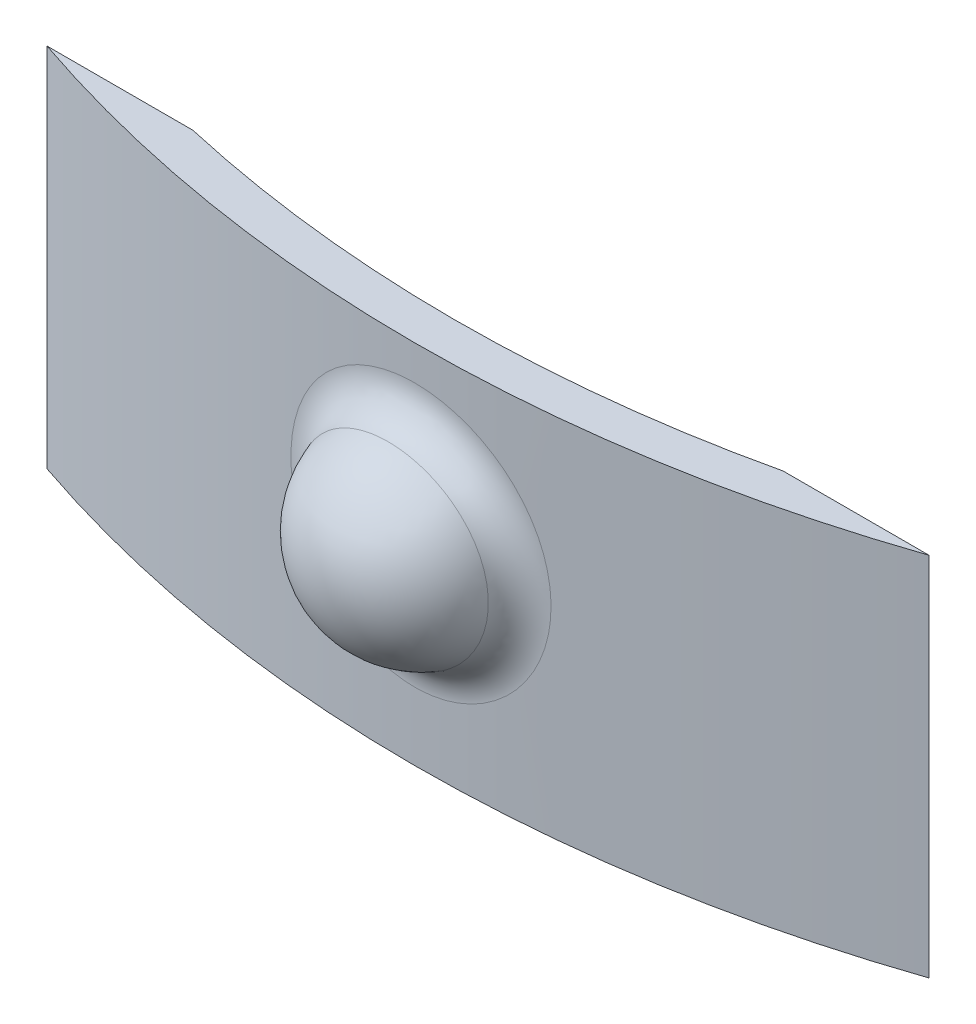
ISO-10303-21;
HEADER;
FILE_DESCRIPTION(('STEP AP214'),'2;1');
FILE_NAME('part.step','',(''),(''),'','','');
FILE_SCHEMA(('AUTOMOTIVE_DESIGN { 1 0 10303 214 1 1 1 1 }'));
ENDSEC;
DATA;
#1=APPLICATION_CONTEXT('core data for automotive mechanical design processes');
#2=APPLICATION_PROTOCOL_DEFINITION('international standard','automotive_design',2000,#1);
#3=PRODUCT_CONTEXT('',#1,'mechanical');
#4=PRODUCT('Part','Part','',(#3));
#5=PRODUCT_RELATED_PRODUCT_CATEGORY('part','',(#4));
#6=PRODUCT_DEFINITION_FORMATION('','',#4);
#7=PRODUCT_DEFINITION_CONTEXT('part definition',#1,'design');
#8=PRODUCT_DEFINITION('design','',#6,#7);
#9=PRODUCT_DEFINITION_SHAPE('','',#8);
#10=(LENGTH_UNIT() NAMED_UNIT(*) SI_UNIT(.MILLI.,.METRE.));
#11=(NAMED_UNIT(*) PLANE_ANGLE_UNIT() SI_UNIT($,.RADIAN.));
#12=(NAMED_UNIT(*) SI_UNIT($,.STERADIAN.) SOLID_ANGLE_UNIT());
#13=UNCERTAINTY_MEASURE_WITH_UNIT(LENGTH_MEASURE(1.E-05),#10,'distance_accuracy_value','');
#14=(GEOMETRIC_REPRESENTATION_CONTEXT(3) GLOBAL_UNCERTAINTY_ASSIGNED_CONTEXT((#13)) GLOBAL_UNIT_ASSIGNED_CONTEXT((#10,
#11,#12)) REPRESENTATION_CONTEXT('',''));
#15=CARTESIAN_POINT('',(0.,0.,0.));
#16=DIRECTION('',(0.,0.,1.));
#17=DIRECTION('',(1.,0.,0.));
#18=AXIS2_PLACEMENT_3D('',#15,#16,#17);
#19=CARTESIAN_POINT('',(0.,-7.62,0.));
#20=DIRECTION('',(0.,1.,0.));
#21=DIRECTION('',(0.,0.,1.));
#22=AXIS2_PLACEMENT_3D('',#19,#20,#21);
#23=PLANE('',#22);
#24=CARTESIAN_POINT('',(0.,-7.62,0.));
#25=DIRECTION('',(0.,1.,0.));
#26=DIRECTION('',(0.,0.,1.));
#27=AXIS2_PLACEMENT_3D('',#24,#25,#26);
#28=CIRCLE('',#27,50.546);
#29=CARTESIAN_POINT('',(-11.2593934117251,-7.62,49.276));
#30=VERTEX_POINT('',#29);
#31=CARTESIAN_POINT('',(11.2593934117251,-7.62,49.276));
#32=VERTEX_POINT('',#31);
#33=EDGE_CURVE('E11',#30,#32,#28,.T.);
#34=ORIENTED_EDGE('',*,*,#33,.T.);
#35=DIRECTION('',(-1.,0.,0.));
#36=VECTOR('',#35,1.);
#37=CARTESIAN_POINT('',(0.,-7.62,49.276));
#38=LINE('',#37,#36);
#39=CARTESIAN_POINT('',(16.8273801882527,-7.62,49.276));
#40=VERTEX_POINT('',#39);
#41=EDGE_CURVE('E45',#40,#32,#38,.T.);
#42=ORIENTED_EDGE('',*,*,#41,.F.);
#43=CARTESIAN_POINT('',(0.,-7.62,0.));
#44=DIRECTION('',(0.,1.,0.));
#45=DIRECTION('',(0.,0.,1.));
#46=AXIS2_PLACEMENT_3D('',#43,#44,#45);
#47=CIRCLE('',#46,52.07);
#48=CARTESIAN_POINT('',(-16.8273801882527,-7.62,49.276));
#49=VERTEX_POINT('',#48);
#50=EDGE_CURVE('E107',#49,#40,#47,.T.);
#51=ORIENTED_EDGE('',*,*,#50,.F.);
#52=DIRECTION('',(-1.,0.,0.));
#53=VECTOR('',#52,1.);
#54=CARTESIAN_POINT('',(0.,-7.62,49.276));
#55=LINE('',#54,#53);
#56=EDGE_CURVE('E51',#30,#49,#55,.T.);
#57=ORIENTED_EDGE('',*,*,#56,.F.);
#58=EDGE_LOOP('',(#34,#42,#51,#57));
#59=FACE_BOUND('',#58,.T.);
#60=ADVANCED_FACE('F38',(#59),#23,.F.);
#61=CARTESIAN_POINT('',(0.,0.,51.816));
#62=DIRECTION('',(0.,1.,0.));
#63=DIRECTION('',(-1.,0.,0.));
#64=AXIS2_PLACEMENT_3D('',#61,#62,#63);
#65=SPHERICAL_SURFACE('',#64,3.81);
#66=CARTESIAN_POINT('',(-0.0256478094244548,5.02887643908641,52.0699936834053));
#67=CARTESIAN_POINT('',(-0.0201786653162026,3.95126101170845,52.0699963773094));
#68=CARTESIAN_POINT('',(-0.0188560550124041,3.59205459934744,53.0859953560924));
#69=CARTESIAN_POINT('',(0.256753570660563,5.0303509438317,52.0701326257342));
#70=CARTESIAN_POINT('',(0.202007338086974,3.95239870261632,52.070076075759));
#71=CARTESIAN_POINT('',(0.188763078079634,3.59310781702199,53.0860975053306));
#72=CARTESIAN_POINT('',(0.539281677263079,5.00740975686317,52.0679527823639));
#73=CARTESIAN_POINT('',(0.42421250485955,3.93471903110067,52.0688277257015));
#74=CARTESIAN_POINT('',(0.396475379447347,3.57672125488846,53.084494902716));
#75=CARTESIAN_POINT('',(1.09658330014422,4.91327455036088,52.0591980755026));
#76=CARTESIAN_POINT('',(0.863041972229046,3.86203588788429,52.0637993241447));
#77=CARTESIAN_POINT('',(0.806198872231116,3.50948182167426,53.078058515436));
#78=CARTESIAN_POINT('',(1.37135667539314,4.84207965385995,52.0526231321348));
#79=CARTESIAN_POINT('',(1.07953497679463,3.80707685579507,52.0600223171547));
#80=CARTESIAN_POINT('',(1.00820995996331,3.45862832418846,53.0732246720457));
#81=CARTESIAN_POINT('',(1.90541320793571,4.65322409592396,52.0358122446449));
#82=CARTESIAN_POINT('',(1.5011044941938,3.66091841170117,52.0503255913651));
#83=CARTESIAN_POINT('',(1.40084385670006,3.32373149708575,53.0608654481651));
#84=CARTESIAN_POINT('',(2.16468994129502,4.53554431648749,52.0255747943944));
#85=CARTESIAN_POINT('',(1.7060828424537,3.56978356717734,52.0444099575079));
#86=CARTESIAN_POINT('',(1.59146194288181,3.23967451175352,53.0533389603817));
#87=CARTESIAN_POINT('',(2.66009617291731,4.2567973789634,52.002599461179));
#88=CARTESIAN_POINT('',(2.09863357590841,3.35328302005037,52.0310708511581));
#89=CARTESIAN_POINT('',(1.95568046163595,3.04056955640494,53.0364476875231));
#90=CARTESIAN_POINT('',(2.89622631492195,4.09573142797794,51.9898616477826));
#91=CARTESIAN_POINT('',(2.28616688154373,3.22800987360914,52.0236521073533));
#92=CARTESIAN_POINT('',(2.12928136748183,2.9255224486044,53.027082953594));
#93=CARTESIAN_POINT('',(3.336631606367,3.73592862260019,51.9634503894941));
#94=CARTESIAN_POINT('',(2.6367613010391,2.94732956321196,52.0081959384188));
#95=CARTESIAN_POINT('',(2.45306365479035,2.66852044466606,53.0076656173655));
#96=CARTESIAN_POINT('',(3.54113654325632,3.53748925678059,51.9497848442568));
#97=CARTESIAN_POINT('',(2.8000138324632,2.7922370918186,52.0001660490523));
#98=CARTESIAN_POINT('',(2.60341397406564,2.52677804036733,52.9976188228253));
#99=CARTESIAN_POINT('',(3.91427960121024,3.10758203719992,51.923004518975));
#100=CARTESIAN_POINT('',(3.09851078922523,2.45533124778453,51.9843632349153));
#101=CARTESIAN_POINT('',(2.87774563003093,2.2197014549947,52.977930151632));
#102=CARTESIAN_POINT('',(4.08292042443481,2.87611667395995,51.9098896974964));
#103=CARTESIAN_POINT('',(3.23382072757573,2.2735554033327,51.9765891842777));
#104=CARTESIAN_POINT('',(3.00172895332629,2.05436905286442,52.9682882445168));
#105=CARTESIAN_POINT('',(4.37700798470702,2.39018868719585,51.8859156763468));
#106=CARTESIAN_POINT('',(3.47015675020773,1.8911044606407,51.9623317348944));
#107=CARTESIAN_POINT('',(3.21793966803126,1.70727763367595,52.9506627446155));
#108=CARTESIAN_POINT('',(4.50303260117775,2.13609816466612,51.8750271634983));
#109=CARTESIAN_POINT('',(3.57172348018552,1.69071861811341,51.9558278911846));
#110=CARTESIAN_POINT('',(3.31059191157343,1.52578440304851,52.9426576010258));
#111=CARTESIAN_POINT('',(4.71122692229067,1.60942853715623,51.8565351568469));
#112=CARTESIAN_POINT('',(3.739655111825,1.27475403363526,51.9447609747939));
#113=CARTESIAN_POINT('',(3.46365463559433,1.14959181195146,52.9290624323854));
#114=CARTESIAN_POINT('',(4.79340079213001,1.33685119093443,51.8489313510566));
#115=CARTESIAN_POINT('',(3.80610521693668,1.05910258082512,51.9401927992679));
#116=CARTESIAN_POINT('',(3.52406817829105,0.954893707737781,52.9234721779641));
#117=CARTESIAN_POINT('',(4.91039787667223,0.785388211445684,51.8379814742518));
#118=CARTESIAN_POINT('',(3.90071864932758,0.622505727672967,51.9336110554342));
#119=CARTESIAN_POINT('',(3.6100834562655,0.560991579675488,52.9154219200851));
#120=CARTESIAN_POINT('',(4.94592005815649,0.506660862425416,51.8345726020452));
#121=CARTESIAN_POINT('',(3.92949972537912,0.40157886790685,51.9315562291145));
#122=CARTESIAN_POINT('',(3.63619906610189,0.361900616007833,52.9129157457167));
#123=CARTESIAN_POINT('',(4.97080080767692,-0.0529815464936421,51.832192792017));
#124=CARTESIAN_POINT('',(3.94964300973952,-0.0419653088443997,51.9301230261814));
#125=CARTESIAN_POINT('',(3.65449118508809,-0.0378439618660956,52.9111661292878));
#126=CARTESIAN_POINT('',(4.96016201522152,-0.333896480388332,51.8332216004466));
#127=CARTESIAN_POINT('',(3.94101943921445,-0.264715511068408,51.9307436346518));
#128=CARTESIAN_POINT('',(3.64666963478231,-0.238497486069446,52.9119225006731));
#129=CARTESIAN_POINT('',(4.89332925697731,-0.887582332559981,51.8395728556964));
#130=CARTESIAN_POINT('',(3.88693066084454,-0.703396868010395,51.9345663495603));
#131=CARTESIAN_POINT('',(3.59753475000418,-0.633987380322827,52.9165918904285));
#132=CARTESIAN_POINT('',(4.83749904355246,-1.16040031482007,51.8448610166937));
#133=CARTESIAN_POINT('',(3.84172829053023,-0.919493259393901,51.9377500474398));
#134=CARTESIAN_POINT('',(3.55648884324133,-0.828857367504784,52.9204797021487));
#135=CARTESIAN_POINT('',(4.68245778362999,-1.69253243148247,51.8590927266793));
#136=CARTESIAN_POINT('',(3.71647221179892,-1.34039770629266,51.9462902470894));
#137=CARTESIAN_POINT('',(3.44250380534484,-1.20895173658967,52.9309427363056));
#138=CARTESIAN_POINT('',(4.58324633818509,-1.95184644167353,51.8680363092838));
#139=CARTESIAN_POINT('',(3.63635327023798,-1.5452995890776,51.9516509979412));
#140=CARTESIAN_POINT('',(3.36956438090851,-1.39417602977026,52.9375179834568));
#141=CARTESIAN_POINT('',(4.34394501701668,-2.45081597160628,51.8886254245676));
#142=CARTESIAN_POINT('',(3.44360870372013,-1.93885182267869,51.9639427754613));
#143=CARTESIAN_POINT('',(3.19363205096507,-1.75058283685816,52.952654928887));
#144=CARTESIAN_POINT('',(4.20369269676194,-2.6903884273575,51.9002816559537));
#145=CARTESIAN_POINT('',(3.33077339744937,-2.12748103022153,51.9708844402547));
#146=CARTESIAN_POINT('',(3.09051971759311,-1.92170601934215,52.9612244927661));
#147=CARTESIAN_POINT('',(3.88661165975018,-3.14223841754475,51.9249877894701));
#148=CARTESIAN_POINT('',(3.07640544777461,-2.48252468454807,51.9855336525562));
#149=CARTESIAN_POINT('',(2.85740439062108,-2.24445601230504,52.9793882355199));
#150=CARTESIAN_POINT('',(3.70978200519552,-3.35451525192845,51.9380377273291));
#151=CARTESIAN_POINT('',(2.93479858861673,-2.64893562208133,51.9932439489599));
#152=CARTESIAN_POINT('',(2.72740070756004,-2.39608232274657,52.9889824406622));
#153=CARTESIAN_POINT('',(3.32205745251828,-3.74883018183852,51.9642858179296));
#154=CARTESIAN_POINT('',(2.62518054227991,-2.95743931225804,52.0086862955778));
#155=CARTESIAN_POINT('',(2.4423488589137,-2.67773584423063,53.0082798173501));
#156=CARTESIAN_POINT('',(3.11074225459797,-3.93043037066609,51.9774836435734));
#157=CARTESIAN_POINT('',(2.45680258016125,-3.09912823842034,52.0164169587708));
#158=CARTESIAN_POINT('',(2.28699169242753,-2.80745026477116,53.0179827484171));
#159=CARTESIAN_POINT('',(2.66174190040788,-4.25524582453447,52.0024087714263));
#160=CARTESIAN_POINT('',(2.09995363935504,-3.35212279846695,52.0309625257213));
#161=CARTESIAN_POINT('',(1.95689038668516,-3.03946130322384,53.0363074939818));
#162=CARTESIAN_POINT('',(2.4240488253367,-4.39844951839563,52.014135629779));
#163=CARTESIAN_POINT('',(1.91147774118884,-3.46334134882035,52.0377741093753));
#164=CARTESIAN_POINT('',(1.78214042559241,-3.14174965600771,53.04492898216));
#165=CARTESIAN_POINT('',(1.92509157567771,-4.6447241189598,52.0350094495615));
#166=CARTESIAN_POINT('',(1.51662527589876,-3.6543875578591,52.0498660971845));
#167=CARTESIAN_POINT('',(1.4153112281151,-3.31766008496029,53.0602752399337));
#168=CARTESIAN_POINT('',(1.6635160314687,-4.74712994092712,52.0441130357612));
#169=CARTESIAN_POINT('',(1.31007365758168,-3.73360645511172,52.0551158599744));
#170=CARTESIAN_POINT('',(1.22300307538822,-3.39080710060235,53.0669681204237));
#171=CARTESIAN_POINT('',(1.12759475049701,-4.90587271787714,52.0584772346008));
#172=CARTESIAN_POINT('',(0.887414565827098,-3.85635672417073,52.0633885834447));
#173=CARTESIAN_POINT('',(0.828998231185929,-3.50419479843612,53.0775285592958));
#174=CARTESIAN_POINT('',(0.853262145858384,-4.96225598550702,52.0637417099803));
#175=CARTESIAN_POINT('',(0.671419623991697,-3.89985563561235,52.06640935544));
#176=CARTESIAN_POINT('',(0.627311194338272,-3.54446856108998,53.0813989575318));
#177=CARTESIAN_POINT('',(0.390978795465778,-5.01692004444642,52.0688642579746));
#178=CARTESIAN_POINT('',(0.307586214647035,-3.94203958014771,52.0693489036818));
#179=CARTESIAN_POINT('',(0.287444340919765,-3.58351431745266,53.0851650119469));
#180=CARTESIAN_POINT('',(0.204399613776943,-5.02823512326483,52.0699331983759));
#181=CARTESIAN_POINT('',(0.160812369755194,-3.95076625428614,52.0699616894079));
#182=CARTESIAN_POINT('',(0.150272886784765,-3.59159651656609,53.0859508879863));
#183=CARTESIAN_POINT('',(-0.16883226631304,-5.02958731964654,52.0700607278954));
#184=CARTESIAN_POINT('',(-0.132830724627417,-3.95180944277735,52.0700348275174));
#185=CARTESIAN_POINT('',(-0.124124070356976,-3.59256237112412,53.0860446466226));
#186=CARTESIAN_POINT('',(-0.355484965204387,-5.0196242928449,52.0691193033739));
#187=CARTESIAN_POINT('',(-0.27965867488771,-3.94412555266946,52.0694951515138));
#188=CARTESIAN_POINT('',(-0.261349573724108,-3.58544592345091,53.0853525191917));
#189=CARTESIAN_POINT('',(-0.820359625975144,-4.96806431137672,52.0642834069517));
#190=CARTESIAN_POINT('',(-0.645514600071284,-3.90433905181015,52.0667203530884));
#191=CARTESIAN_POINT('',(-0.603121536863108,-3.54861736528373,53.0817972086154));
#192=CARTESIAN_POINT('',(-1.0972656298414,-4.91304254778585,52.059138615037));
#193=CARTESIAN_POINT('',(-0.863516543281382,-3.86189446102376,52.0637687341229));
#194=CARTESIAN_POINT('',(-0.80670051530389,-3.50931610551701,53.0780148006621));
#195=CARTESIAN_POINT('',(-1.63840029191505,-4.75620936156148,52.0449234210887));
#196=CARTESIAN_POINT('',(-1.29024700199229,-3.74063145323444,52.0555831380968));
#197=CARTESIAN_POINT('',(-1.2045381936974,-3.39729240105928,53.0675639089395));
#198=CARTESIAN_POINT('',(-1.90261501073197,-4.65434773441719,52.035848807552));
#199=CARTESIAN_POINT('',(-1.49885847473763,-3.66184310669717,52.0503512050201));
#200=CARTESIAN_POINT('',(-1.39878664552685,-3.32453409600354,53.0608923289083));
#201=CARTESIAN_POINT('',(-2.41059732631565,-4.40644767655325,52.0147917446968));
#202=CARTESIAN_POINT('',(-1.90080698447127,-3.4695568377352,52.0381553467124));
#203=CARTESIAN_POINT('',(-1.77225099599596,-3.1474626261182,53.0454113523617));
#204=CARTESIAN_POINT('',(-2.65436611706408,-4.26041182777477,52.0028094653367));
#205=CARTESIAN_POINT('',(-2.09408671914006,-3.35615019237268,52.0311964971753));
#206=CARTESIAN_POINT('',(-1.95146777244098,-3.0431513055323,53.0366020807984));
#207=CARTESIAN_POINT('',(-3.11426652850968,-3.92804916088858,51.9772966961473));
#208=CARTESIAN_POINT('',(-2.4595935831767,-3.09728017696763,52.0163083180778));
#209=CARTESIAN_POINT('',(-2.28958270914469,-2.80574940064942,53.0178453062355));
#210=CARTESIAN_POINT('',(-3.33040498886041,-3.74173234484446,51.9637665910466));
#211=CARTESIAN_POINT('',(-2.63182457917428,-2.9519084276015,52.0083825035811));
#212=CARTESIAN_POINT('',(-2.44848589785947,-2.67266596068357,53.0078980860852));
#213=CARTESIAN_POINT('',(-3.72720139332955,-3.3353298275758,51.936809888896));
#214=CARTESIAN_POINT('',(-2.94871725891149,-2.63391884534089,51.9925206027703));
#215=CARTESIAN_POINT('',(-2.74020729601628,-2.38237844818863,52.9880797441164));
#216=CARTESIAN_POINT('',(-3.90810360711124,-3.11549693739006,51.9233832480298));
#217=CARTESIAN_POINT('',(-3.09361561380864,-2.4615576856405,51.9845851813021));
#218=CARTESIAN_POINT('',(-2.87320509047525,-2.22535495497507,52.978208590084));
#219=CARTESIAN_POINT('',(-4.2308358889577,-2.64719514460847,51.8980849744444));
#220=CARTESIAN_POINT('',(-3.352574816907,-2.09350911110627,51.9695791653405));
#221=CARTESIAN_POINT('',(-3.11047516542009,-1.89085367445082,52.9596095109053));
#222=CARTESIAN_POINT('',(-4.37266777568966,-2.39872757567937,51.8862132693586));
#223=CARTESIAN_POINT('',(-3.46671847529593,-1.89782318761295,51.9625054088098));
#224=CARTESIAN_POINT('',(-3.21474878297483,-1.71337683975921,52.9508815325556));
#225=CARTESIAN_POINT('',(-4.61096752932058,-1.88427757003226,51.8655765843671));
#226=CARTESIAN_POINT('',(-3.65871313295236,-1.49194792181168,51.9501791207486));
#227=CARTESIAN_POINT('',(-3.38994476879458,-1.34591255003464,52.9357096142607));
#228=CARTESIAN_POINT('',(-4.70809681104576,-1.6186216093854,51.8567668140505));
#229=CARTESIAN_POINT('',(-3.73717612195199,-1.28197541535776,51.9448957239101));
#230=CARTESIAN_POINT('',(-3.46135340372801,-1.15615829220283,52.9292327447794));
#231=CARTESIAN_POINT('',(-4.85712148361142,-1.0740942433452,51.8430219946288));
#232=CARTESIAN_POINT('',(-3.85759984516515,-0.851170395258845,51.9366443990287));
#233=CARTESIAN_POINT('',(-3.57091509689659,-0.767210173550993,52.9191276684951));
#234=CARTESIAN_POINT('',(-4.90902099161398,-0.795224043250734,51.838086592853));
#235=CARTESIAN_POINT('',(-3.89962961861218,-0.630235597288075,51.933671930383));
#236=CARTESIAN_POINT('',(-3.60907118203476,-0.568017173658692,52.9154992024115));
#237=CARTESIAN_POINT('',(-4.96555767376359,-0.23627734161319,51.8327014628658));
#238=CARTESIAN_POINT('',(-3.94539150361747,-0.187335751327455,51.9304300264458));
#239=CARTESIAN_POINT('',(-3.65063647787761,-0.168769529814284,52.9115400998765));
#240=CARTESIAN_POINT('',(-4.97083166860076,0.0437304722633059,51.8321912957282));
#241=CARTESIAN_POINT('',(-3.94966650082615,0.0347011287872723,51.9301222721616));
#242=CARTESIAN_POINT('',(-3.65451387385292,0.0312360515165734,52.9111650292327));
#243=CARTESIAN_POINT('',(-4.9356229866862,0.600644366329077,51.8355556469129));
#244=CARTESIAN_POINT('',(-3.92116320672467,0.476059823698198,51.9321482197363));
#245=CARTESIAN_POINT('',(-3.62862874529339,0.429031690206182,52.913638472085));
#246=CARTESIAN_POINT('',(-4.89514212840436,0.877550569346317,51.8394299909782));
#247=CARTESIAN_POINT('',(-3.88836947714916,0.695512220223637,51.9344830203777));
#248=CARTESIAN_POINT('',(-3.59886755768234,0.626821835299192,52.9164868574688));
#249=CARTESIAN_POINT('',(-4.7699497990054,1.41921026489903,51.8510980167545));
#250=CARTESIAN_POINT('',(-3.78715106795522,1.1242596899383,51.9414938528266));
#251=CARTESIAN_POINT('',(-3.50682720428037,1.01372161773342,52.9250650924672));
#252=CARTESIAN_POINT('',(-4.68542650777843,1.68401028797568,51.8588750184174));
#253=CARTESIAN_POINT('',(-3.71882276170274,1.33370134892242,51.9461636458582));
#254=CARTESIAN_POINT('',(-3.44468638677738,1.2028644911766,52.93078267905));
#255=CARTESIAN_POINT('',(-4.47482239135441,2.19534937477479,51.8774707823781));
#256=CARTESIAN_POINT('',(-3.54899383735206,1.73745327053144,51.9572874898198));
#257=CARTESIAN_POINT('',(-3.28985200140055,1.56810669604452,52.9444541291988));
#258=CARTESIAN_POINT('',(-4.34874037781051,2.44188791607417,51.8882896316546));
#259=CARTESIAN_POINT('',(-3.44741484438726,1.93182807594967,51.9637461709135));
#260=CARTESIAN_POINT('',(-3.19715755986407,1.74420565430993,52.9524080567107));
#261=CARTESIAN_POINT('',(-4.05762982340946,2.91182492210153,51.9118671121506));
#262=CARTESIAN_POINT('',(-3.21353297557877,2.30160108225641,51.9777615614867));
#263=CARTESIAN_POINT('',(-2.98313551490143,2.07987494438722,52.9697420232298));
#264=CARTESIAN_POINT('',(-3.89230938989896,3.1350309695728,51.9246400133138));
#265=CARTESIAN_POINT('',(-3.08092197577439,2.47685450157217,51.9853297837485));
#266=CARTESIAN_POINT('',(-2.86159331443209,2.23930783529887,52.9791325533807));
#267=CARTESIAN_POINT('',(-3.52807798709669,3.55018069289813,51.9506575851244));
#268=CARTESIAN_POINT('',(-2.78959737582871,2.80214911882654,52.0006785846405));
#269=CARTESIAN_POINT('',(-2.59381343284036,2.53584335192749,52.9982604546024));
#270=CARTESIAN_POINT('',(-3.32916462597477,3.74212214078691,51.9639022893114));
#271=CARTESIAN_POINT('',(-2.63082504967537,2.95215468391276,52.0084600922109));
#272=CARTESIAN_POINT('',(-2.44757399326447,2.67294438624069,53.0079978503312));
#273=CARTESIAN_POINT('',(-2.90021127829641,4.09238082861202,51.9896184936823));
#274=CARTESIAN_POINT('',(-2.28934773090087,3.22538911414493,52.0235093786533));
#275=CARTESIAN_POINT('',(-2.13221107921436,2.92312916333051,53.0269041887339));
#276=CARTESIAN_POINT('',(-2.66975274591997,4.25015614047122,52.0020755826898));
#277=CARTESIAN_POINT('',(-2.10631010765737,3.3481126001499,52.0307654677121));
#278=CARTESIAN_POINT('',(-1.96277989335075,3.03582581462133,53.0360625364324));
#279=CARTESIAN_POINT('',(-2.18657893956274,4.52435994606165,52.0246308082746));
#280=CARTESIAN_POINT('',(-1.72341685029446,3.56110266109444,52.0438626946357));
#281=CARTESIAN_POINT('',(-1.60755455136819,3.2316856757379,53.0526449496724));
#282=CARTESIAN_POINT('',(-1.93386193230875,4.64078521629565,52.0347287609213));
#283=CARTESIAN_POINT('',(-1.52359567609938,3.65128124131598,52.0496993777082));
#284=CARTESIAN_POINT('',(-1.42175912096128,3.31484658306562,53.0600688799896));
#285=CARTESIAN_POINT('',(-1.40945551609441,4.83071667149954,52.0515904182868));
#286=CARTESIAN_POINT('',(-1.10958159791363,3.79829328502848,52.059427826933));
#287=CARTESIAN_POINT('',(-1.03621990904947,3.4505119082167,53.0724654294628));
#288=CARTESIAN_POINT('',(-1.13754659615473,4.90358576346897,52.058304414187));
#289=CARTESIAN_POINT('',(-0.895316020643894,3.85455273015014,52.0632856901066));
#290=CARTESIAN_POINT('',(-0.83631474490794,3.50256125961074,53.0774015031115));
#291=CARTESIAN_POINT('',(-0.585682897853317,5.0019357540489,52.0674372643695));
#292=CARTESIAN_POINT('',(-0.46072904495697,3.93049651533248,52.0685320880437));
#293=CARTESIAN_POINT('',(-0.430589168801683,3.57281125288106,53.0841158981981));
#294=CARTESIAN_POINT('',(-0.305727679411019,5.02741405566168,52.0698558832664));
#295=CARTESIAN_POINT('',(-0.24053389918454,3.9501326951528,52.0699173355595));
#296=CARTESIAN_POINT('',(-0.224768433293399,3.59101003975899,53.0858940465828));
#297=CARTESIAN_POINT('',(-0.0256478094244548,5.02887643908641,52.0699936834053));
#298=CARTESIAN_POINT('',(-0.0201786653162026,3.95126101170845,52.0699963773094));
#299=CARTESIAN_POINT('',(-0.0188560550124041,3.59205459934744,53.0859953560924));
#300=(BOUNDED_SURFACE() B_SPLINE_SURFACE(3,2,((#66,#67,#68),(#69,#70,#71),(#72,#73,#74),(#75,
#76,#77),(#78,#79,#80),(#81,#82,#83),(#84,#85,#86),(#87,#88,#89),(#90,#91,#92),(#93,#94,#95),
(#96,#97,#98),(#99,#100,#101),(#102,#103,#104),(#105,#106,#107),(#108,#109,#110),(#111,#112,
#113),(#114,#115,#116),(#117,#118,#119),(#120,#121,#122),(#123,#124,#125),(#126,#127,#128),
(#129,#130,#131),(#132,#133,#134),(#135,#136,#137),(#138,#139,#140),(#141,#142,#143),(#144,#145,
#146),(#147,#148,#149),(#150,#151,#152),(#153,#154,#155),(#156,#157,#158),(#159,#160,#161),
(#162,#163,#164),(#165,#166,#167),(#168,#169,#170),(#171,#172,#173),(#174,#175,#176),(#177,#178,
#179),(#180,#181,#182),(#183,#184,#185),(#186,#187,#188),(#189,#190,#191),(#192,#193,#194),
(#195,#196,#197),(#198,#199,#200),(#201,#202,#203),(#204,#205,#206),(#207,#208,#209),(#210,#211,
#212),(#213,#214,#215),(#216,#217,#218),(#219,#220,#221),(#222,#223,#224),(#225,#226,#227),
(#228,#229,#230),(#231,#232,#233),(#234,#235,#236),(#237,#238,#239),(#240,#241,#242),(#243,#244,
#245),(#246,#247,#248),(#249,#250,#251),(#252,#253,#254),(#255,#256,#257),(#258,#259,#260),
(#261,#262,#263),(#264,#265,#266),(#267,#268,#269),(#270,#271,#272),(#273,#274,#275),(#276,#277,
#278),(#279,#280,#281),(#282,#283,#284),(#285,#286,#287),(#288,#289,#290),(#291,#292,#293),
(#294,#295,#296),(#297,#298,#299)),.UNSPECIFIED.,.T.,.F.,.F.) B_SPLINE_SURFACE_WITH_KNOTS((4,2,
2,2,2,2,2,2,2,2,2,2,2,2,2,2,2,2,2,2,2,2,2,2,2,2,2,2,2,2,2,2,2,2,2,2,2,2,4),(3,3),(0.,
0.870993446450054,1.74200272283616,2.61337059586792,3.48471422796357,4.34939468263235,
5.2140099653755,6.06638084203138,6.91867074116113,7.75803961177165,8.59736048746744,
9.42999194188378,10.2626310535985,11.0986114860009,11.9346133545656,12.7816916781174,
13.6290249912666,14.4896557737654,15.3494194292536,15.9254360456918,16.5014565702255,
17.3681137317007,18.2357019779086,19.1032395242048,19.9705619013853,20.831639167193,
21.6926763443243,22.5405281765963,23.3883028228057,24.2244801973638,25.0606243402577,
25.8932248387939,26.7258491471101,27.5648729583533,28.4039565336397,29.2555064994339,
30.1071228343698,30.9709088542846,31.8347422079582),(0.,1.),
.UNSPECIFIED.) GEOMETRIC_REPRESENTATION_ITEM() RATIONAL_B_SPLINE_SURFACE(((1.,0.816496941748759,
1.),(1.,0.816489005208578,1.),(1.,0.816613555825614,1.),(1.,0.817113419194057,1.),(1.,
0.817488736502917,1.),(1.,0.818447285549964,1.),(1.,0.819030602823412,1.),(1.,0.820337905571916,
1.),(1.,0.821061887133214,1.),(1.,0.822560805260064,1.),(1.,0.823335309835809,1.),(1.,
0.824850975049924,1.),(1.,0.825592138197064,1.),(1.,0.826945401513559,1.),(1.,0.82755918078902,
1.),(1.,0.828600725634337,1.),(1.,0.829028508870456,1.),(1.,0.829644315019028,1.),(1.,
0.829835874465911,1.),(1.,0.829969620984357,1.),(1.,0.829911822314348,1.),(1.,0.829554805457686,
1.),(1.,0.829257515065792,1.),(1.,0.828456678705733,1.),(1.,0.827953130840763,1.),(1.,
0.826792480339247,1.),(1.,0.826134769607409,1.),(1.,0.824738769692104,1.),(1.,0.824000478442882,
1.),(1.,0.822513436571796,1.),(1.,0.821764676973297,1.),(1.,0.820348798169505,1.),(1.,
0.819681703607653,1.),(1.,0.818493118183908,1.),(1.,0.817974076619032,1.),(1.,0.817154634635509,
1.),(1.,0.816854014452272,1.),(1.,0.816561461876901,1.),(1.,0.816500396841062,1.),(1.,
0.816493111959352,1.),(1.,0.816546892892671,1.),(1.,0.816823082483938,1.),(1.,0.817116882298563,
1.),(1.,0.817927865326496,1.),(1.,0.818445288190489,1.),(1.,0.819644376032219,1.),(1.,
0.820326031410247,1.),(1.,0.821775301719308,1.),(1.,0.822542895288477,1.),(1.,0.824069994360532,
1.),(1.,0.824829518304112,1.),(1.,0.826258791475635,1.),(1.,0.826928544881523,1.),(1.,
0.828091680243927,1.),(1.,0.828587605978479,1.),(1.,0.82936093572978,1.),(1.,0.829638359636024,
1.),(1.,0.829941046949377,1.),(1.,0.829969707911973,1.),(1.,0.829780623620008,1.),(1.,
0.829562888158168,1.),(1.,0.828906611417198,1.),(1.,0.828469009841228,1.),(1.,0.827421451438997,
1.),(1.,0.826811489684272,1.),(1.,0.825480409371666,1.),(1.,0.824758472501647,1.),(1.,
0.823285849775608,1.),(1.,0.822535161875449,1.),(1.,0.821075683495941,1.),(1.,0.820367681195879,
1.),(1.,0.819084347421963,1.),(1.,0.818509026292671,1.),(1.,0.817547656896915,1.),(1.,
0.817164430843744,1.),(1.,0.816643002204202,1.),(1.,0.816504813045781,1.),(1.,0.816496941748759,1.))) REPRESENTATION_ITEM('') SURFACE());
#301=CARTESIAN_POINT('',(-0.0188560550124041,3.59205459934744,53.0859953560924));
#302=CARTESIAN_POINT('',(-0.224768433293399,3.59101003975899,53.0858940465828));
#303=CARTESIAN_POINT('',(-0.430589168801683,3.57281125288106,53.0841158981981));
#304=CARTESIAN_POINT('',(-0.83631474490794,3.50256125961074,53.0774015031115));
#305=CARTESIAN_POINT('',(-1.03621990904947,3.4505119082167,53.0724654294628));
#306=CARTESIAN_POINT('',(-1.42175912096128,3.31484658306562,53.0600688799896));
#307=CARTESIAN_POINT('',(-1.60755455136819,3.2316856757379,53.0526449496724));
#308=CARTESIAN_POINT('',(-1.96277989335075,3.03582581462133,53.0360625364324));
#309=CARTESIAN_POINT('',(-2.13221107921436,2.92312916333051,53.0269041887339));
#310=CARTESIAN_POINT('',(-2.44757399326447,2.67294438624069,53.0079978503312));
#311=CARTESIAN_POINT('',(-2.59381343284036,2.53584335192749,52.9982604546024));
#312=CARTESIAN_POINT('',(-2.86159331443209,2.23930783529887,52.9791325533807));
#313=CARTESIAN_POINT('',(-2.98313551490143,2.07987494438722,52.9697420232298));
#314=CARTESIAN_POINT('',(-3.19715755986407,1.74420565430993,52.9524080567107));
#315=CARTESIAN_POINT('',(-3.28985200140055,1.56810669604453,52.9444541291988));
#316=CARTESIAN_POINT('',(-3.44468638677737,1.2028644911766,52.93078267905));
#317=CARTESIAN_POINT('',(-3.50682720428037,1.01372161773341,52.9250650924672));
#318=CARTESIAN_POINT('',(-3.59886755768234,0.626821835299191,52.9164868574688));
#319=CARTESIAN_POINT('',(-3.62862874529339,0.429031690206183,52.913638472085));
#320=CARTESIAN_POINT('',(-3.65451387385292,0.0312360515165738,52.9111650292327));
#321=CARTESIAN_POINT('',(-3.65063647787761,-0.168769529814283,52.9115400998765));
#322=CARTESIAN_POINT('',(-3.60907118203476,-0.568017173658692,52.9154992024115));
#323=CARTESIAN_POINT('',(-3.57091509689659,-0.767210173550993,52.9191276684951));
#324=CARTESIAN_POINT('',(-3.46135340372801,-1.15615829220283,52.9292327447794));
#325=CARTESIAN_POINT('',(-3.38994476879459,-1.34591255003464,52.9357096142607));
#326=CARTESIAN_POINT('',(-3.21474878297483,-1.71337683975921,52.9508815325556));
#327=CARTESIAN_POINT('',(-3.11047516542009,-1.89085367445082,52.9596095109053));
#328=CARTESIAN_POINT('',(-2.87320509047525,-2.22535495497507,52.978208590084));
#329=CARTESIAN_POINT('',(-2.74020729601628,-2.38237844818863,52.9880797441164));
#330=CARTESIAN_POINT('',(-2.44848589785947,-2.67266596068357,53.0078980860852));
#331=CARTESIAN_POINT('',(-2.28958270914469,-2.80574940064942,53.0178453062355));
#332=CARTESIAN_POINT('',(-1.95146777244098,-3.0431513055323,53.0366020807984));
#333=CARTESIAN_POINT('',(-1.77225099599596,-3.1474626261182,53.0454113523617));
#334=CARTESIAN_POINT('',(-1.39878664552685,-3.32453409600354,53.0608923289083));
#335=CARTESIAN_POINT('',(-1.2045381936974,-3.39729240105928,53.0675639089395));
#336=CARTESIAN_POINT('',(-0.80670051530389,-3.50931610551701,53.0780148006621));
#337=CARTESIAN_POINT('',(-0.603121536863108,-3.54861736528373,53.0817972086154));
#338=CARTESIAN_POINT('',(-0.261349573724108,-3.58544592345091,53.0853525191917));
#339=CARTESIAN_POINT('',(-0.124124070356976,-3.59256237112412,53.0860446466226));
#340=CARTESIAN_POINT('',(0.150272886784765,-3.59159651656609,53.0859508879863));
#341=CARTESIAN_POINT('',(0.287444340919765,-3.58351431745266,53.0851650119469));
#342=CARTESIAN_POINT('',(0.627311194338272,-3.54446856108998,53.0813989575318));
#343=CARTESIAN_POINT('',(0.828998231185929,-3.50419479843612,53.0775285592958));
#344=CARTESIAN_POINT('',(1.22300307538822,-3.39080710060235,53.0669681204237));
#345=CARTESIAN_POINT('',(1.4153112281151,-3.31766008496029,53.0602752399337));
#346=CARTESIAN_POINT('',(1.78214042559241,-3.14174965600771,53.04492898216));
#347=CARTESIAN_POINT('',(1.95689038668516,-3.03946130322384,53.0363074939818));
#348=CARTESIAN_POINT('',(2.28699169242753,-2.80745026477116,53.0179827484171));
#349=CARTESIAN_POINT('',(2.4423488589137,-2.67773584423063,53.0082798173501));
#350=CARTESIAN_POINT('',(2.72740070756004,-2.39608232274657,52.9889824406622));
#351=CARTESIAN_POINT('',(2.85740439062108,-2.24445601230504,52.9793882355199));
#352=CARTESIAN_POINT('',(3.09051971759311,-1.92170601934215,52.9612244927661));
#353=CARTESIAN_POINT('',(3.19363205096507,-1.75058283685816,52.9526549288871));
#354=CARTESIAN_POINT('',(3.36956438090851,-1.39417602977026,52.9375179834568));
#355=CARTESIAN_POINT('',(3.44250380534484,-1.20895173658967,52.9309427363056));
#356=CARTESIAN_POINT('',(3.55648884324133,-0.828857367504784,52.9204797021487));
#357=CARTESIAN_POINT('',(3.59753475000418,-0.633987380322827,52.9165918904285));
#358=CARTESIAN_POINT('',(3.64666963478231,-0.238497486069446,52.9119225006731));
#359=CARTESIAN_POINT('',(3.65449118508809,-0.0378439618660957,52.9111661292878));
#360=CARTESIAN_POINT('',(3.63619906610189,0.361900616007833,52.9129157457167));
#361=CARTESIAN_POINT('',(3.6100834562655,0.560991579675488,52.9154219200851));
#362=CARTESIAN_POINT('',(3.52406817829105,0.954893707737781,52.9234721779641));
#363=CARTESIAN_POINT('',(3.46365463559433,1.14959181195146,52.9290624323854));
#364=CARTESIAN_POINT('',(3.31059191157343,1.52578440304851,52.9426576010258));
#365=CARTESIAN_POINT('',(3.21793966803126,1.70727763367595,52.9506627446155));
#366=CARTESIAN_POINT('',(3.00172895332629,2.05436905286442,52.9682882445168));
#367=CARTESIAN_POINT('',(2.87774563003093,2.2197014549947,52.977930151632));
#368=CARTESIAN_POINT('',(2.60341397406564,2.52677804036733,52.9976188228253));
#369=CARTESIAN_POINT('',(2.45306365479035,2.66852044466606,53.0076656173655));
#370=CARTESIAN_POINT('',(2.12928136748183,2.9255224486044,53.027082953594));
#371=CARTESIAN_POINT('',(1.95568046163595,3.04056955640494,53.0364476875231));
#372=CARTESIAN_POINT('',(1.59146194288181,3.23967451175352,53.0533389603817));
#373=CARTESIAN_POINT('',(1.40084385670006,3.32373149708575,53.0608654481651));
#374=CARTESIAN_POINT('',(1.00820995996331,3.45862832418846,53.0732246720457));
#375=CARTESIAN_POINT('',(0.806198872231116,3.50948182167426,53.078058515436));
#376=CARTESIAN_POINT('',(0.396475379447347,3.57672125488847,53.084494902716));
#377=CARTESIAN_POINT('',(0.188763078079634,3.59310781702199,53.0860975053306));
#378=CARTESIAN_POINT('',(-0.0188560550124041,3.59205459934744,53.0859953560924));
#379=B_SPLINE_CURVE_WITH_KNOTS('',3,(#301,#302,#303,#304,#305,#306,#307,#308,#309,#310,#311,
#312,#313,#314,#315,#316,#317,#318,#319,#320,#321,#322,#323,#324,#325,#326,#327,#328,#329,#330,
#331,#332,#333,#334,#335,#336,#337,#338,#339,#340,#341,#342,#343,#344,#345,#346,#347,#348,#349,
#350,#351,#352,#353,#354,#355,#356,#357,#358,#359,#360,#361,#362,#363,#364,#365,#366,#367,#368,
#369,#370,#371,#372,#373,#374,#375,#376,#377,#378),.UNSPECIFIED.,.T.,.F.,(4,2,2,2,2,2,2,2,2,2,2,
2,2,2,2,2,2,2,2,2,2,2,2,2,2,2,2,2,2,2,2,2,2,2,2,2,2,2,4),(0.,0.863833353673554,1.7276193735884,
2.57923570852424,3.43078567431848,4.26986924960486,5.10889306084806,5.94151736916424,
6.7741178677005,7.61026201059438,8.4464393851525,9.2942140313619,10.1420658636339,
11.0031030407652,11.8641803065729,12.7315026837534,13.5990402300496,14.4666284762574,
15.3332856377327,15.9093061622664,16.4853227787045,17.3450864341927,18.2057172166916,
19.0530505298408,19.9001288533926,20.7361307219573,21.5721111543597,22.4047502660744,
23.2373817204907,24.0767025961865,24.916071466797,25.7683613659268,26.6207322425827,
27.4853475253258,28.3500279799946,29.2213716120903,30.092739485122,30.9637487615081,
31.8347422079582),.UNSPECIFIED.);
#380=CARTESIAN_POINT('',(-0.0188560550124041,3.59205459934744,53.0859953560924));
#381=VERTEX_POINT('',#380);
#382=EDGE_CURVE('E109',#381,#381,#379,.T.);
#383=ORIENTED_EDGE('',*,*,#382,.T.);
#384=EDGE_LOOP('',(#383));
#385=FACE_BOUND('',#384,.T.);
#386=ADVANCED_FACE('F130',(#385),#65,.T.);
#387=CARTESIAN_POINT('',(0.,6.35,0.));
#388=DIRECTION('',(0.,1.,0.));
#389=DIRECTION('',(0.,0.,1.));
#390=AXIS2_PLACEMENT_3D('',#387,#388,#389);
#391=PLANE('',#390);
#392=DIRECTION('',(-1.,0.,0.));
#393=VECTOR('',#392,1.);
#394=CARTESIAN_POINT('',(0.,6.35,49.276));
#395=LINE('',#394,#393);
#396=CARTESIAN_POINT('',(-11.2593934117251,6.35,49.276));
#397=VERTEX_POINT('',#396);
#398=CARTESIAN_POINT('',(-16.8273801882527,6.35,49.276));
#399=VERTEX_POINT('',#398);
#400=EDGE_CURVE('E81',#397,#399,#395,.T.);
#401=ORIENTED_EDGE('',*,*,#400,.T.);
#402=CARTESIAN_POINT('',(0.,6.35,0.));
#403=DIRECTION('',(0.,1.,0.));
#404=DIRECTION('',(0.,0.,1.));
#405=AXIS2_PLACEMENT_3D('',#402,#403,#404);
#406=CIRCLE('',#405,52.07);
#407=CARTESIAN_POINT('',(16.8273801882527,6.35,49.276));
#408=VERTEX_POINT('',#407);
#409=EDGE_CURVE('E92',#399,#408,#406,.T.);
#410=ORIENTED_EDGE('',*,*,#409,.T.);
#411=DIRECTION('',(-1.,0.,0.));
#412=VECTOR('',#411,1.);
#413=CARTESIAN_POINT('',(0.,6.35,49.276));
#414=LINE('',#413,#412);
#415=CARTESIAN_POINT('',(11.2593934117251,6.35,49.276));
#416=VERTEX_POINT('',#415);
#417=EDGE_CURVE('E95',#408,#416,#414,.T.);
#418=ORIENTED_EDGE('',*,*,#417,.T.);
#419=CARTESIAN_POINT('',(0.,6.35,0.));
#420=DIRECTION('',(0.,1.,0.));
#421=DIRECTION('',(0.,0.,1.));
#422=AXIS2_PLACEMENT_3D('',#419,#420,#421);
#423=CIRCLE('',#422,50.546);
#424=EDGE_CURVE('E94',#397,#416,#423,.T.);
#425=ORIENTED_EDGE('',*,*,#424,.F.);
#426=EDGE_LOOP('',(#401,#410,#418,#425));
#427=FACE_BOUND('',#426,.T.);
#428=ADVANCED_FACE('F90',(#427),#391,.T.);
#429=CARTESIAN_POINT('',(0.,0.,49.276));
#430=DIRECTION('',(0.,0.,1.));
#431=DIRECTION('',(1.,0.,0.));
#432=AXIS2_PLACEMENT_3D('',#429,#430,#431);
#433=PLANE('',#432);
#434=DIRECTION('',(0.,-1.,0.));
#435=VECTOR('',#434,1.);
#436=CARTESIAN_POINT('',(16.8273801882527,0.,49.276));
#437=LINE('',#436,#435);
#438=EDGE_CURVE('E85',#40,#408,#437,.F.);
#439=ORIENTED_EDGE('',*,*,#438,.F.);
#440=ORIENTED_EDGE('',*,*,#41,.T.);
#441=DIRECTION('',(0.,-1.,0.));
#442=VECTOR('',#441,1.);
#443=CARTESIAN_POINT('',(11.2593934117251,0.,49.276));
#444=LINE('',#443,#442);
#445=EDGE_CURVE('E102',#32,#416,#444,.F.);
#446=ORIENTED_EDGE('',*,*,#445,.T.);
#447=ORIENTED_EDGE('',*,*,#417,.F.);
#448=EDGE_LOOP('',(#439,#440,#446,#447));
#449=FACE_BOUND('',#448,.T.);
#450=ADVANCED_FACE('F154',(#449),#433,.F.);
#451=DIRECTION('',(0.,-1.,0.));
#452=VECTOR('',#451,1.);
#453=CARTESIAN_POINT('',(-11.2593934117251,0.,49.276));
#454=LINE('',#453,#452);
#455=EDGE_CURVE('E86',#397,#30,#454,.T.);
#456=ORIENTED_EDGE('',*,*,#455,.T.);
#457=ORIENTED_EDGE('',*,*,#56,.T.);
#458=DIRECTION('',(0.,-1.,0.));
#459=VECTOR('',#458,1.);
#460=CARTESIAN_POINT('',(-16.8273801882527,0.,49.276));
#461=LINE('',#460,#459);
#462=EDGE_CURVE('E77',#399,#49,#461,.T.);
#463=ORIENTED_EDGE('',*,*,#462,.F.);
#464=ORIENTED_EDGE('',*,*,#400,.F.);
#465=EDGE_LOOP('',(#456,#457,#463,#464));
#466=FACE_BOUND('',#465,.T.);
#467=ADVANCED_FACE('F80',(#466),#433,.F.);
#468=CARTESIAN_POINT('',(-0.0256478094244548,5.02887643908641,52.0699936834053));
#469=CARTESIAN_POINT('',(0.256753570660563,5.0303509438317,52.0701326257342));
#470=CARTESIAN_POINT('',(0.539281677263079,5.00740975686317,52.0679527823639));
#471=CARTESIAN_POINT('',(1.09658330014422,4.91327455036088,52.0591980755026));
#472=CARTESIAN_POINT('',(1.37135667539314,4.84207965385995,52.0526231321348));
#473=CARTESIAN_POINT('',(1.90541320793571,4.65322409592396,52.0358122446449));
#474=CARTESIAN_POINT('',(2.16468994129502,4.53554431648749,52.0255747943944));
#475=CARTESIAN_POINT('',(2.66009617291731,4.2567973789634,52.002599461179));
#476=CARTESIAN_POINT('',(2.89622631492195,4.09573142797794,51.9898616477826));
#477=CARTESIAN_POINT('',(3.336631606367,3.73592862260019,51.9634503894941));
#478=CARTESIAN_POINT('',(3.54113654325632,3.53748925678059,51.9497848442568));
#479=CARTESIAN_POINT('',(3.91427960121024,3.10758203719992,51.923004518975));
#480=CARTESIAN_POINT('',(4.08292042443481,2.87611667395995,51.9098896974964));
#481=CARTESIAN_POINT('',(4.37700798470702,2.39018868719585,51.8859156763468));
#482=CARTESIAN_POINT('',(4.50303260117775,2.13609816466612,51.8750271634983));
#483=CARTESIAN_POINT('',(4.71122692229067,1.60942853715623,51.8565351568469));
#484=CARTESIAN_POINT('',(4.79340079213001,1.33685119093443,51.8489313510566));
#485=CARTESIAN_POINT('',(4.91039787667223,0.785388211445684,51.8379814742518));
#486=CARTESIAN_POINT('',(4.94592005815649,0.506660862425416,51.8345726020451));
#487=CARTESIAN_POINT('',(4.97080080767692,-0.0529815464936424,51.832192792017));
#488=CARTESIAN_POINT('',(4.96016201522152,-0.333896480388332,51.8332216004466));
#489=CARTESIAN_POINT('',(4.89332925697731,-0.887582332559981,51.8395728556964));
#490=CARTESIAN_POINT('',(4.83749904355246,-1.16040031482007,51.8448610166937));
#491=CARTESIAN_POINT('',(4.68245778362999,-1.69253243148247,51.8590927266793));
#492=CARTESIAN_POINT('',(4.58324633818509,-1.95184644167353,51.8680363092838));
#493=CARTESIAN_POINT('',(4.34394501701668,-2.45081597160628,51.8886254245676));
#494=CARTESIAN_POINT('',(4.20369269676194,-2.6903884273575,51.9002816559537));
#495=CARTESIAN_POINT('',(3.88661165975018,-3.14223841754475,51.9249877894701));
#496=CARTESIAN_POINT('',(3.70978200519552,-3.35451525192845,51.9380377273291));
#497=CARTESIAN_POINT('',(3.32205745251828,-3.74883018183852,51.9642858179296));
#498=CARTESIAN_POINT('',(3.11074225459797,-3.93043037066609,51.9774836435734));
#499=CARTESIAN_POINT('',(2.66174190040788,-4.25524582453447,52.0024087714263));
#500=CARTESIAN_POINT('',(2.4240488253367,-4.39844951839563,52.014135629779));
#501=CARTESIAN_POINT('',(1.92509157567771,-4.6447241189598,52.0350094495615));
#502=CARTESIAN_POINT('',(1.6635160314687,-4.74712994092712,52.0441130357612));
#503=CARTESIAN_POINT('',(1.12759475049701,-4.90587271787714,52.0584772346008));
#504=CARTESIAN_POINT('',(0.853262145858384,-4.96225598550702,52.0637417099803));
#505=CARTESIAN_POINT('',(0.390978795465778,-5.01692004444642,52.0688642579746));
#506=CARTESIAN_POINT('',(0.204399613776943,-5.02823512326483,52.0699331983759));
#507=CARTESIAN_POINT('',(-0.16883226631304,-5.02958731964654,52.0700607278954));
#508=CARTESIAN_POINT('',(-0.355484965204387,-5.0196242928449,52.0691193033739));
#509=CARTESIAN_POINT('',(-0.820359625975143,-4.96806431137672,52.0642834069517));
#510=CARTESIAN_POINT('',(-1.0972656298414,-4.91304254778585,52.059138615037));
#511=CARTESIAN_POINT('',(-1.63840029191505,-4.75620936156148,52.0449234210887));
#512=CARTESIAN_POINT('',(-1.90261501073197,-4.65434773441719,52.035848807552));
#513=CARTESIAN_POINT('',(-2.41059732631565,-4.40644767655325,52.0147917446968));
#514=CARTESIAN_POINT('',(-2.65436611706408,-4.26041182777477,52.0028094653367));
#515=CARTESIAN_POINT('',(-3.11426652850968,-3.92804916088858,51.9772966961473));
#516=CARTESIAN_POINT('',(-3.33040498886041,-3.74173234484446,51.9637665910466));
#517=CARTESIAN_POINT('',(-3.72720139332955,-3.3353298275758,51.936809888896));
#518=CARTESIAN_POINT('',(-3.90810360711124,-3.11549693739006,51.9233832480298));
#519=CARTESIAN_POINT('',(-4.23083588895769,-2.64719514460847,51.8980849744444));
#520=CARTESIAN_POINT('',(-4.37266777568966,-2.39872757567937,51.8862132693586));
#521=CARTESIAN_POINT('',(-4.61096752932058,-1.88427757003226,51.8655765843671));
#522=CARTESIAN_POINT('',(-4.70809681104576,-1.6186216093854,51.8567668140505));
#523=CARTESIAN_POINT('',(-4.85712148361142,-1.0740942433452,51.8430219946288));
#524=CARTESIAN_POINT('',(-4.90902099161398,-0.795224043250734,51.838086592853));
#525=CARTESIAN_POINT('',(-4.96555767376359,-0.23627734161319,51.8327014628658));
#526=CARTESIAN_POINT('',(-4.97083166860076,0.0437304722633065,51.8321912957282));
#527=CARTESIAN_POINT('',(-4.9356229866862,0.600644366329078,51.8355556469129));
#528=CARTESIAN_POINT('',(-4.89514212840436,0.877550569346316,51.8394299909782));
#529=CARTESIAN_POINT('',(-4.7699497990054,1.41921026489903,51.8510980167545));
#530=CARTESIAN_POINT('',(-4.68542650777843,1.68401028797568,51.8588750184174));
#531=CARTESIAN_POINT('',(-4.47482239135441,2.1953493747748,51.8774707823781));
#532=CARTESIAN_POINT('',(-4.34874037781051,2.44188791607417,51.8882896316546));
#533=CARTESIAN_POINT('',(-4.05762982340946,2.91182492210153,51.9118671121506));
#534=CARTESIAN_POINT('',(-3.89230938989896,3.1350309695728,51.9246400133138));
#535=CARTESIAN_POINT('',(-3.52807798709669,3.55018069289813,51.9506575851244));
#536=CARTESIAN_POINT('',(-3.32916462597477,3.74212214078691,51.9639022893114));
#537=CARTESIAN_POINT('',(-2.90021127829641,4.09238082861202,51.9896184936823));
#538=CARTESIAN_POINT('',(-2.66975274591997,4.25015614047122,52.0020755826898));
#539=CARTESIAN_POINT('',(-2.18657893956274,4.52435994606165,52.0246308082746));
#540=CARTESIAN_POINT('',(-1.93386193230875,4.64078521629565,52.0347287609213));
#541=CARTESIAN_POINT('',(-1.40945551609441,4.83071667149954,52.0515904182868));
#542=CARTESIAN_POINT('',(-1.13754659615473,4.90358576346897,52.058304414187));
#543=CARTESIAN_POINT('',(-0.585682897853317,5.0019357540489,52.0674372643695));
#544=CARTESIAN_POINT('',(-0.30572767941102,5.02741405566168,52.0698558832664));
#545=CARTESIAN_POINT('',(-0.0256478094244548,5.02887643908641,52.0699936834053));
#546=B_SPLINE_CURVE_WITH_KNOTS('',3,(#468,#469,#470,#471,#472,#473,#474,#475,#476,#477,#478,
#479,#480,#481,#482,#483,#484,#485,#486,#487,#488,#489,#490,#491,#492,#493,#494,#495,#496,#497,
#498,#499,#500,#501,#502,#503,#504,#505,#506,#507,#508,#509,#510,#511,#512,#513,#514,#515,#516,
#517,#518,#519,#520,#521,#522,#523,#524,#525,#526,#527,#528,#529,#530,#531,#532,#533,#534,#535,
#536,#537,#538,#539,#540,#541,#542,#543,#544,#545),.UNSPECIFIED.,.T.,.F.,(4,2,2,2,2,2,2,2,2,2,2,
2,2,2,2,2,2,2,2,2,2,2,2,2,2,2,2,2,2,2,2,2,2,2,2,2,2,2,4),(0.,0.870993446450054,1.74200272283616,
2.61337059586792,3.48471422796357,4.34939468263235,5.2140099653755,6.06638084203138,
6.91867074116113,7.75803961177165,8.59736048746744,9.42999194188378,10.2626310535985,
11.0986114860009,11.9346133545656,12.7816916781174,13.6290249912666,14.4896557737654,
15.3494194292536,15.9254360456918,16.5014565702255,17.3681137317007,18.2357019779086,
19.1032395242048,19.9705619013853,20.831639167193,21.6926763443243,22.5405281765963,
23.3883028228057,24.2244801973638,25.0606243402577,25.8932248387939,26.7258491471101,
27.5648729583533,28.4039565336397,29.2555064994339,30.1071228343698,30.9709088542846,
31.8347422079582),.UNSPECIFIED.);
#547=CARTESIAN_POINT('',(-0.0256478094244548,5.02887643908641,52.0699936834053));
#548=VERTEX_POINT('',#547);
#549=EDGE_CURVE('E106',#548,#548,#546,.T.);
#550=CARTESIAN_POINT('',(-0.0263984770173657,5.02887643908641,53.5939934985294));
#551=DIRECTION('',(-0.99998699996738,-0.00507516336269498,-0.000492557693746552));
#552=DIRECTION('',(0.000492564037343092,0.,-0.999999878690327));
#553=AXIS2_PLACEMENT_3D('',#550,#551,#552);
#554=CIRCLE('',#553,1.524);
#555=EDGE_CURVE('',#548,#381,#554,.T.);
#556=ORIENTED_EDGE('',*,*,#549,.F.);
#557=ORIENTED_EDGE('',*,*,#382,.F.);
#558=ORIENTED_EDGE('',*,*,#555,.T.);
#559=ORIENTED_EDGE('',*,*,#555,.F.);
#560=EDGE_LOOP('',(#556,#558,#557,#559));
#561=FACE_BOUND('',#560,.T.);
#562=ADVANCED_FACE('F136',(#561),#300,.F.);
#563=CARTESIAN_POINT('',(0.,0.,0.));
#564=DIRECTION('',(0.,-1.,0.));
#565=DIRECTION('',(0.,0.,-1.));
#566=AXIS2_PLACEMENT_3D('',#563,#564,#565);
#567=CYLINDRICAL_SURFACE('',#566,52.07);
#568=ORIENTED_EDGE('',*,*,#549,.T.);
#569=EDGE_LOOP('',(#568));
#570=FACE_BOUND('',#569,.T.);
#571=ORIENTED_EDGE('',*,*,#462,.T.);
#572=ORIENTED_EDGE('',*,*,#50,.T.);
#573=ORIENTED_EDGE('',*,*,#438,.T.);
#574=ORIENTED_EDGE('',*,*,#409,.F.);
#575=EDGE_LOOP('',(#571,#572,#573,#574));
#576=FACE_BOUND('',#575,.T.);
#577=ADVANCED_FACE('F97',(#570,#576),#567,.T.);
#578=CARTESIAN_POINT('',(0.,0.,0.));
#579=DIRECTION('',(0.,-1.,0.));
#580=DIRECTION('',(0.,0.,-1.));
#581=AXIS2_PLACEMENT_3D('',#578,#579,#580);
#582=CYLINDRICAL_SURFACE('',#581,50.546);
#583=ORIENTED_EDGE('',*,*,#33,.F.);
#584=ORIENTED_EDGE('',*,*,#455,.F.);
#585=ORIENTED_EDGE('',*,*,#424,.T.);
#586=ORIENTED_EDGE('',*,*,#445,.F.);
#587=EDGE_LOOP('',(#583,#584,#585,#586));
#588=FACE_BOUND('',#587,.T.);
#589=ADVANCED_FACE('F152',(#588),#582,.F.);
#590=CLOSED_SHELL('',(#60,#386,#428,#450,#467,#562,#577,#589));
#591=MANIFOLD_SOLID_BREP('B2',#590);
#592=ADVANCED_BREP_SHAPE_REPRESENTATION('',(#18,#591),#14);
#593=SHAPE_DEFINITION_REPRESENTATION(#9,#592);
ENDSEC;
END-ISO-10303-21;
